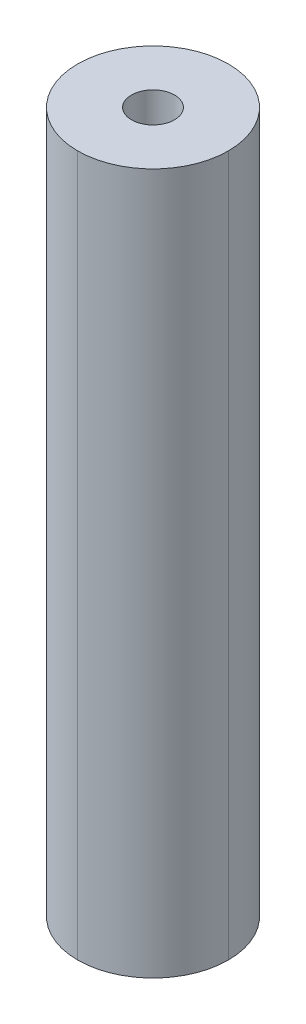
ISO-10303-21;
HEADER;
FILE_DESCRIPTION(('STEP AP214'),'2;1');
FILE_NAME('part.step','',(''),(''),'','','');
FILE_SCHEMA(('AUTOMOTIVE_DESIGN { 1 0 10303 214 1 1 1 1 }'));
ENDSEC;
DATA;
#1=APPLICATION_CONTEXT('core data for automotive mechanical design processes');
#2=APPLICATION_PROTOCOL_DEFINITION('international standard','automotive_design',2000,#1);
#3=PRODUCT_CONTEXT('',#1,'mechanical');
#4=PRODUCT('Part','Part','',(#3));
#5=PRODUCT_RELATED_PRODUCT_CATEGORY('part','',(#4));
#6=PRODUCT_DEFINITION_FORMATION('','',#4);
#7=PRODUCT_DEFINITION_CONTEXT('part definition',#1,'design');
#8=PRODUCT_DEFINITION('design','',#6,#7);
#9=PRODUCT_DEFINITION_SHAPE('','',#8);
#10=(LENGTH_UNIT() NAMED_UNIT(*) SI_UNIT(.MILLI.,.METRE.));
#11=(NAMED_UNIT(*) PLANE_ANGLE_UNIT() SI_UNIT($,.RADIAN.));
#12=(NAMED_UNIT(*) SI_UNIT($,.STERADIAN.) SOLID_ANGLE_UNIT());
#13=UNCERTAINTY_MEASURE_WITH_UNIT(LENGTH_MEASURE(1.E-05),#10,'distance_accuracy_value','');
#14=(GEOMETRIC_REPRESENTATION_CONTEXT(3) GLOBAL_UNCERTAINTY_ASSIGNED_CONTEXT((#13)) GLOBAL_UNIT_ASSIGNED_CONTEXT((#10,
#11,#12)) REPRESENTATION_CONTEXT('',''));
#15=CARTESIAN_POINT('',(0.,0.,0.));
#16=DIRECTION('',(0.,0.,1.));
#17=DIRECTION('',(1.,0.,0.));
#18=AXIS2_PLACEMENT_3D('',#15,#16,#17);
#19=CARTESIAN_POINT('',(0.,65.1,0.));
#20=DIRECTION('',(0.,1.,0.));
#21=DIRECTION('',(0.,0.,1.));
#22=AXIS2_PLACEMENT_3D('',#19,#20,#21);
#23=PLANE('',#22);
#24=CARTESIAN_POINT('',(0.,65.1,0.));
#25=DIRECTION('',(0.,1.,0.));
#26=DIRECTION('',(0.,0.,1.));
#27=AXIS2_PLACEMENT_3D('',#24,#25,#26);
#28=CIRCLE('',#27,2.);
#29=CARTESIAN_POINT('',(0.,65.1,2.));
#30=VERTEX_POINT('',#29);
#31=EDGE_CURVE('E115',#30,#30,#28,.T.);
#32=ORIENTED_EDGE('',*,*,#31,.F.);
#33=EDGE_LOOP('',(#32));
#34=FACE_BOUND('',#33,.T.);
#35=CARTESIAN_POINT('',(0.,65.1,0.));
#36=DIRECTION('',(0.,1.,0.));
#37=DIRECTION('',(0.,0.,1.));
#38=AXIS2_PLACEMENT_3D('',#35,#36,#37);
#39=CIRCLE('',#38,7.);
#40=CARTESIAN_POINT('',(0.,65.1,-7.));
#41=VERTEX_POINT('',#40);
#42=CARTESIAN_POINT('',(-7.,65.1,0.));
#43=VERTEX_POINT('',#42);
#44=EDGE_CURVE('E55',#41,#43,#39,.T.);
#45=ORIENTED_EDGE('',*,*,#44,.T.);
#46=CARTESIAN_POINT('',(0.,65.1,0.));
#47=DIRECTION('',(0.,1.,0.));
#48=DIRECTION('',(0.,0.,1.));
#49=AXIS2_PLACEMENT_3D('',#46,#47,#48);
#50=CIRCLE('',#49,7.);
#51=CARTESIAN_POINT('',(0.,65.1,7.));
#52=VERTEX_POINT('',#51);
#53=EDGE_CURVE('E11',#43,#52,#50,.T.);
#54=ORIENTED_EDGE('',*,*,#53,.T.);
#55=CARTESIAN_POINT('',(0.,65.1,0.));
#56=DIRECTION('',(0.,1.,0.));
#57=DIRECTION('',(0.,0.,1.));
#58=AXIS2_PLACEMENT_3D('',#55,#56,#57);
#59=CIRCLE('',#58,7.);
#60=CARTESIAN_POINT('',(7.,65.1,0.));
#61=VERTEX_POINT('',#60);
#62=EDGE_CURVE('E124',#52,#61,#59,.T.);
#63=ORIENTED_EDGE('',*,*,#62,.T.);
#64=CARTESIAN_POINT('',(0.,65.1,0.));
#65=DIRECTION('',(0.,1.,0.));
#66=DIRECTION('',(0.,0.,1.));
#67=AXIS2_PLACEMENT_3D('',#64,#65,#66);
#68=CIRCLE('',#67,7.);
#69=EDGE_CURVE('E105',#61,#41,#68,.T.);
#70=ORIENTED_EDGE('',*,*,#69,.T.);
#71=EDGE_LOOP('',(#45,#54,#63,#70));
#72=FACE_BOUND('',#71,.T.);
#73=ADVANCED_FACE('F45',(#34,#72),#23,.T.);
#74=CARTESIAN_POINT('',(0.,0.,0.));
#75=DIRECTION('',(0.,1.,0.));
#76=DIRECTION('',(0.,0.,1.));
#77=AXIS2_PLACEMENT_3D('',#74,#75,#76);
#78=PLANE('',#77);
#79=CARTESIAN_POINT('',(0.,0.,0.));
#80=DIRECTION('',(0.,1.,0.));
#81=DIRECTION('',(0.,0.,1.));
#82=AXIS2_PLACEMENT_3D('',#79,#80,#81);
#83=CIRCLE('',#82,2.);
#84=CARTESIAN_POINT('',(0.,0.,2.));
#85=VERTEX_POINT('',#84);
#86=EDGE_CURVE('E111',#85,#85,#83,.T.);
#87=ORIENTED_EDGE('',*,*,#86,.T.);
#88=EDGE_LOOP('',(#87));
#89=FACE_BOUND('',#88,.T.);
#90=CARTESIAN_POINT('',(0.,0.,0.));
#91=DIRECTION('',(0.,1.,0.));
#92=DIRECTION('',(0.,0.,1.));
#93=AXIS2_PLACEMENT_3D('',#90,#91,#92);
#94=CIRCLE('',#93,7.);
#95=CARTESIAN_POINT('',(7.,0.,0.));
#96=VERTEX_POINT('',#95);
#97=CARTESIAN_POINT('',(0.,0.,7.));
#98=VERTEX_POINT('',#97);
#99=EDGE_CURVE('E94',#96,#98,#94,.F.);
#100=ORIENTED_EDGE('',*,*,#99,.T.);
#101=CARTESIAN_POINT('',(0.,0.,0.));
#102=DIRECTION('',(0.,1.,0.));
#103=DIRECTION('',(0.,0.,1.));
#104=AXIS2_PLACEMENT_3D('',#101,#102,#103);
#105=CIRCLE('',#104,7.);
#106=CARTESIAN_POINT('',(-7.,0.,0.));
#107=VERTEX_POINT('',#106);
#108=EDGE_CURVE('E121',#98,#107,#105,.F.);
#109=ORIENTED_EDGE('',*,*,#108,.T.);
#110=CARTESIAN_POINT('',(0.,0.,0.));
#111=DIRECTION('',(0.,1.,0.));
#112=DIRECTION('',(0.,0.,1.));
#113=AXIS2_PLACEMENT_3D('',#110,#111,#112);
#114=CIRCLE('',#113,7.);
#115=CARTESIAN_POINT('',(0.,0.,-7.));
#116=VERTEX_POINT('',#115);
#117=EDGE_CURVE('E96',#107,#116,#114,.F.);
#118=ORIENTED_EDGE('',*,*,#117,.T.);
#119=CARTESIAN_POINT('',(0.,0.,0.));
#120=DIRECTION('',(0.,1.,0.));
#121=DIRECTION('',(0.,0.,1.));
#122=AXIS2_PLACEMENT_3D('',#119,#120,#121);
#123=CIRCLE('',#122,7.);
#124=EDGE_CURVE('E89',#116,#96,#123,.F.);
#125=ORIENTED_EDGE('',*,*,#124,.T.);
#126=EDGE_LOOP('',(#100,#109,#118,#125));
#127=FACE_BOUND('',#126,.T.);
#128=ADVANCED_FACE('F91',(#89,#127),#78,.F.);
#129=CARTESIAN_POINT('',(0.,0.,0.));
#130=DIRECTION('',(0.,1.,0.));
#131=DIRECTION('',(0.,0.,1.));
#132=AXIS2_PLACEMENT_3D('',#129,#130,#131);
#133=CYLINDRICAL_SURFACE('',#132,2.);
#134=ORIENTED_EDGE('',*,*,#86,.F.);
#135=EDGE_LOOP('',(#134));
#136=FACE_BOUND('',#135,.T.);
#137=ORIENTED_EDGE('',*,*,#31,.T.);
#138=EDGE_LOOP('',(#137));
#139=FACE_BOUND('',#138,.T.);
#140=ADVANCED_FACE('F142',(#136,#139),#133,.F.);
#141=CARTESIAN_POINT('',(0.,65.1,0.));
#142=DIRECTION('',(0.,-1.,0.));
#143=DIRECTION('',(0.,0.,-1.));
#144=AXIS2_PLACEMENT_3D('',#141,#142,#143);
#145=CYLINDRICAL_SURFACE('',#144,7.);
#146=DIRECTION('',(0.,-1.,0.));
#147=VECTOR('',#146,1.);
#148=CARTESIAN_POINT('',(7.,65.1,0.));
#149=LINE('',#148,#147);
#150=EDGE_CURVE('E104',#96,#61,#149,.F.);
#151=ORIENTED_EDGE('',*,*,#150,.F.);
#152=ORIENTED_EDGE('',*,*,#124,.F.);
#153=DIRECTION('',(0.,-1.,0.));
#154=VECTOR('',#153,1.);
#155=CARTESIAN_POINT('',(0.,65.1,-7.));
#156=LINE('',#155,#154);
#157=EDGE_CURVE('E49',#41,#116,#156,.T.);
#158=ORIENTED_EDGE('',*,*,#157,.F.);
#159=ORIENTED_EDGE('',*,*,#69,.F.);
#160=EDGE_LOOP('',(#151,#152,#158,#159));
#161=FACE_BOUND('',#160,.T.);
#162=ADVANCED_FACE('F47',(#161),#145,.T.);
#163=CARTESIAN_POINT('',(0.,65.1,0.));
#164=DIRECTION('',(0.,-1.,0.));
#165=DIRECTION('',(0.,0.,-1.));
#166=AXIS2_PLACEMENT_3D('',#163,#164,#165);
#167=CYLINDRICAL_SURFACE('',#166,7.);
#168=ORIENTED_EDGE('',*,*,#157,.T.);
#169=ORIENTED_EDGE('',*,*,#117,.F.);
#170=DIRECTION('',(0.,-1.,0.));
#171=VECTOR('',#170,1.);
#172=CARTESIAN_POINT('',(-7.,65.1,0.));
#173=LINE('',#172,#171);
#174=EDGE_CURVE('E108',#43,#107,#173,.T.);
#175=ORIENTED_EDGE('',*,*,#174,.F.);
#176=ORIENTED_EDGE('',*,*,#44,.F.);
#177=EDGE_LOOP('',(#168,#169,#175,#176));
#178=FACE_BOUND('',#177,.T.);
#179=ADVANCED_FACE('F136',(#178),#167,.T.);
#180=CARTESIAN_POINT('',(0.,65.1,0.));
#181=DIRECTION('',(0.,-1.,0.));
#182=DIRECTION('',(0.,0.,-1.));
#183=AXIS2_PLACEMENT_3D('',#180,#181,#182);
#184=CYLINDRICAL_SURFACE('',#183,7.);
#185=ORIENTED_EDGE('',*,*,#150,.T.);
#186=ORIENTED_EDGE('',*,*,#62,.F.);
#187=DIRECTION('',(0.,-1.,0.));
#188=VECTOR('',#187,1.);
#189=CARTESIAN_POINT('',(0.,65.1,7.));
#190=LINE('',#189,#188);
#191=EDGE_CURVE('E63',#98,#52,#190,.F.);
#192=ORIENTED_EDGE('',*,*,#191,.F.);
#193=ORIENTED_EDGE('',*,*,#99,.F.);
#194=EDGE_LOOP('',(#185,#186,#192,#193));
#195=FACE_BOUND('',#194,.T.);
#196=ADVANCED_FACE('F109',(#195),#184,.T.);
#197=CARTESIAN_POINT('',(0.,65.1,0.));
#198=DIRECTION('',(0.,-1.,0.));
#199=DIRECTION('',(0.,0.,-1.));
#200=AXIS2_PLACEMENT_3D('',#197,#198,#199);
#201=CYLINDRICAL_SURFACE('',#200,7.);
#202=ORIENTED_EDGE('',*,*,#53,.F.);
#203=ORIENTED_EDGE('',*,*,#174,.T.);
#204=ORIENTED_EDGE('',*,*,#108,.F.);
#205=ORIENTED_EDGE('',*,*,#191,.T.);
#206=EDGE_LOOP('',(#202,#203,#204,#205));
#207=FACE_BOUND('',#206,.T.);
#208=ADVANCED_FACE('F134',(#207),#201,.T.);
#209=CLOSED_SHELL('',(#73,#128,#140,#162,#179,#196,#208));
#210=MANIFOLD_SOLID_BREP('B2',#209);
#211=ADVANCED_BREP_SHAPE_REPRESENTATION('',(#18,#210),#14);
#212=SHAPE_DEFINITION_REPRESENTATION(#9,#211);
ENDSEC;
END-ISO-10303-21;
